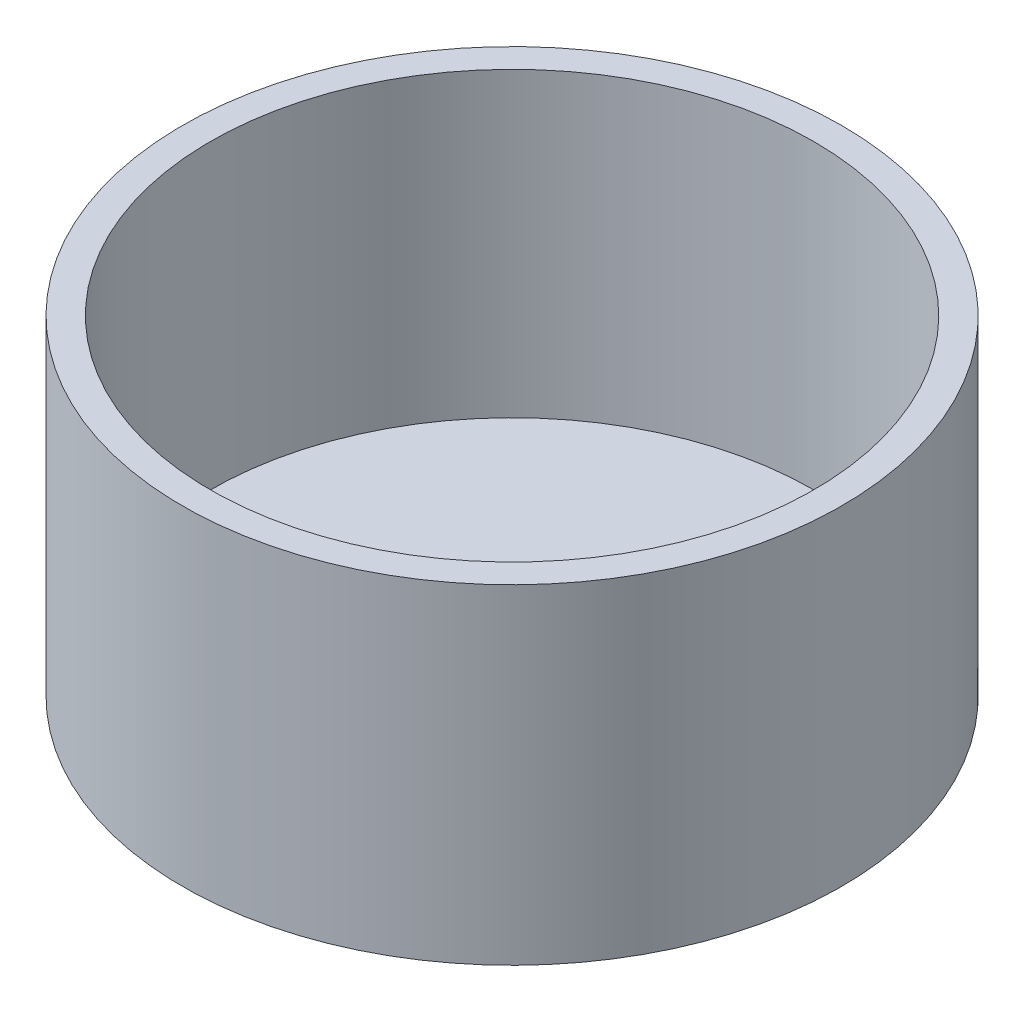
ISO-10303-21;
HEADER;
FILE_DESCRIPTION(('STEP AP214'),'2;1');
FILE_NAME('part.step','',(''),(''),'','','');
FILE_SCHEMA(('AUTOMOTIVE_DESIGN { 1 0 10303 214 1 1 1 1 }'));
ENDSEC;
DATA;
#1=APPLICATION_CONTEXT('core data for automotive mechanical design processes');
#2=APPLICATION_PROTOCOL_DEFINITION('international standard','automotive_design',2000,#1);
#3=PRODUCT_CONTEXT('',#1,'mechanical');
#4=PRODUCT('Part','Part','',(#3));
#5=PRODUCT_RELATED_PRODUCT_CATEGORY('part','',(#4));
#6=PRODUCT_DEFINITION_FORMATION('','',#4);
#7=PRODUCT_DEFINITION_CONTEXT('part definition',#1,'design');
#8=PRODUCT_DEFINITION('design','',#6,#7);
#9=PRODUCT_DEFINITION_SHAPE('','',#8);
#10=(LENGTH_UNIT() NAMED_UNIT(*) SI_UNIT(.MILLI.,.METRE.));
#11=(NAMED_UNIT(*) PLANE_ANGLE_UNIT() SI_UNIT($,.RADIAN.));
#12=(NAMED_UNIT(*) SI_UNIT($,.STERADIAN.) SOLID_ANGLE_UNIT());
#13=UNCERTAINTY_MEASURE_WITH_UNIT(LENGTH_MEASURE(1.E-05),#10,'distance_accuracy_value','');
#14=(GEOMETRIC_REPRESENTATION_CONTEXT(3) GLOBAL_UNCERTAINTY_ASSIGNED_CONTEXT((#13)) GLOBAL_UNIT_ASSIGNED_CONTEXT((#10,
#11,#12)) REPRESENTATION_CONTEXT('',''));
#15=CARTESIAN_POINT('',(0.,0.,0.));
#16=DIRECTION('',(0.,0.,1.));
#17=DIRECTION('',(1.,0.,0.));
#18=AXIS2_PLACEMENT_3D('',#15,#16,#17);
#19=CARTESIAN_POINT('',(0.,54.19,0.));
#20=DIRECTION('',(0.,1.,0.));
#21=DIRECTION('',(0.,0.,1.));
#22=AXIS2_PLACEMENT_3D('',#19,#20,#21);
#23=PLANE('',#22);
#24=CARTESIAN_POINT('',(0.,54.19,0.));
#25=DIRECTION('',(0.,1.,0.));
#26=DIRECTION('',(0.,0.,1.));
#27=AXIS2_PLACEMENT_3D('',#24,#25,#26);
#28=CIRCLE('',#27,59.19);
#29=CARTESIAN_POINT('',(0.,54.19,-59.19));
#30=VERTEX_POINT('',#29);
#31=EDGE_CURVE('E11',#30,#30,#28,.T.);
#32=ORIENTED_EDGE('',*,*,#31,.T.);
#33=EDGE_LOOP('',(#32));
#34=FACE_BOUND('',#33,.T.);
#35=CARTESIAN_POINT('',(0.,54.19,0.));
#36=DIRECTION('',(0.,1.,0.));
#37=DIRECTION('',(0.,0.,1.));
#38=AXIS2_PLACEMENT_3D('',#35,#36,#37);
#39=CIRCLE('',#38,54.19);
#40=CARTESIAN_POINT('',(0.,54.19,-54.19));
#41=VERTEX_POINT('',#40);
#42=EDGE_CURVE('E57',#41,#41,#39,.T.);
#43=ORIENTED_EDGE('',*,*,#42,.F.);
#44=EDGE_LOOP('',(#43));
#45=FACE_BOUND('',#44,.T.);
#46=ADVANCED_FACE('F49',(#34,#45),#23,.T.);
#47=CARTESIAN_POINT('',(0.,54.19,0.));
#48=DIRECTION('',(0.,-1.,0.));
#49=DIRECTION('',(0.,0.,-1.));
#50=AXIS2_PLACEMENT_3D('',#47,#48,#49);
#51=CYLINDRICAL_SURFACE('',#50,59.19);
#52=CARTESIAN_POINT('',(0.,-5.,0.));
#53=DIRECTION('',(0.,1.,0.));
#54=DIRECTION('',(0.,0.,1.));
#55=AXIS2_PLACEMENT_3D('',#52,#53,#54);
#56=CIRCLE('',#55,59.19);
#57=CARTESIAN_POINT('',(0.,-5.,-59.19));
#58=VERTEX_POINT('',#57);
#59=EDGE_CURVE('E68',#58,#58,#56,.T.);
#60=CARTESIAN_POINT('',(0.,54.19,-59.19));
#61=CARTESIAN_POINT('',(0.,53.5734375,-59.19));
#62=CARTESIAN_POINT('',(0.,52.956875,-59.19));
#63=CARTESIAN_POINT('',(0.,51.72375,-59.19));
#64=CARTESIAN_POINT('',(0.,51.1071875,-59.19));
#65=CARTESIAN_POINT('',(0.,49.8740625,-59.19));
#66=CARTESIAN_POINT('',(0.,49.2575,-59.19));
#67=CARTESIAN_POINT('',(0.,48.024375,-59.19));
#68=CARTESIAN_POINT('',(0.,47.4078125,-59.19));
#69=CARTESIAN_POINT('',(0.,46.1746875,-59.19));
#70=CARTESIAN_POINT('',(0.,45.558125,-59.19));
#71=CARTESIAN_POINT('',(0.,44.325,-59.19));
#72=CARTESIAN_POINT('',(0.,43.7084375,-59.19));
#73=CARTESIAN_POINT('',(0.,42.4753125,-59.19));
#74=CARTESIAN_POINT('',(0.,41.85875,-59.19));
#75=CARTESIAN_POINT('',(0.,40.625625,-59.19));
#76=CARTESIAN_POINT('',(0.,40.0090625,-59.19));
#77=CARTESIAN_POINT('',(0.,38.7759375,-59.19));
#78=CARTESIAN_POINT('',(0.,38.159375,-59.19));
#79=CARTESIAN_POINT('',(0.,36.92625,-59.19));
#80=CARTESIAN_POINT('',(0.,36.3096875,-59.19));
#81=CARTESIAN_POINT('',(0.,35.0765625,-59.19));
#82=CARTESIAN_POINT('',(0.,34.46,-59.19));
#83=CARTESIAN_POINT('',(0.,33.226875,-59.19));
#84=CARTESIAN_POINT('',(0.,32.6103125,-59.19));
#85=CARTESIAN_POINT('',(0.,31.3771875,-59.19));
#86=CARTESIAN_POINT('',(0.,30.760625,-59.19));
#87=CARTESIAN_POINT('',(0.,29.5275,-59.19));
#88=CARTESIAN_POINT('',(0.,28.9109375,-59.19));
#89=CARTESIAN_POINT('',(0.,27.6778125,-59.19));
#90=CARTESIAN_POINT('',(0.,27.06125,-59.19));
#91=CARTESIAN_POINT('',(0.,25.828125,-59.19));
#92=CARTESIAN_POINT('',(0.,25.2115625,-59.19));
#93=CARTESIAN_POINT('',(0.,23.9784375,-59.19));
#94=CARTESIAN_POINT('',(0.,23.361875,-59.19));
#95=CARTESIAN_POINT('',(0.,22.12875,-59.19));
#96=CARTESIAN_POINT('',(0.,21.5121875,-59.19));
#97=CARTESIAN_POINT('',(0.,20.2790625,-59.19));
#98=CARTESIAN_POINT('',(0.,19.6625,-59.19));
#99=CARTESIAN_POINT('',(0.,18.429375,-59.19));
#100=CARTESIAN_POINT('',(0.,17.8128125,-59.19));
#101=CARTESIAN_POINT('',(0.,16.5796875,-59.19));
#102=CARTESIAN_POINT('',(0.,15.963125,-59.19));
#103=CARTESIAN_POINT('',(0.,14.73,-59.19));
#104=CARTESIAN_POINT('',(0.,14.1134375,-59.19));
#105=CARTESIAN_POINT('',(0.,12.8803125,-59.19));
#106=CARTESIAN_POINT('',(0.,12.26375,-59.19));
#107=CARTESIAN_POINT('',(0.,11.030625,-59.19));
#108=CARTESIAN_POINT('',(0.,10.4140625,-59.19));
#109=CARTESIAN_POINT('',(0.,9.1809375,-59.19));
#110=CARTESIAN_POINT('',(0.,8.564375,-59.19));
#111=CARTESIAN_POINT('',(0.,7.33125,-59.19));
#112=CARTESIAN_POINT('',(0.,6.7146875,-59.19));
#113=CARTESIAN_POINT('',(0.,5.4815625,-59.19));
#114=CARTESIAN_POINT('',(0.,4.86499999999999,-59.19));
#115=CARTESIAN_POINT('',(0.,3.631875,-59.19));
#116=CARTESIAN_POINT('',(0.,3.0153125,-59.19));
#117=CARTESIAN_POINT('',(0.,1.7821875,-59.19));
#118=CARTESIAN_POINT('',(0.,1.165625,-59.19));
#119=CARTESIAN_POINT('',(0.,-0.0675000000000049,-59.19));
#120=CARTESIAN_POINT('',(0.,-0.684062500000006,-59.19));
#121=CARTESIAN_POINT('',(0.,-1.91718750000001,-59.19));
#122=CARTESIAN_POINT('',(0.,-2.53375,-59.19));
#123=CARTESIAN_POINT('',(0.,-3.766875,-59.19));
#124=CARTESIAN_POINT('',(0.,-4.3834375,-59.19));
#125=CARTESIAN_POINT('',(0.,-5.,-59.19));
#126=B_SPLINE_CURVE_WITH_KNOTS('',3,(#60,#61,#62,#63,#64,#65,#66,#67,#68,#69,#70,#71,#72,#73,
#74,#75,#76,#77,#78,#79,#80,#81,#82,#83,#84,#85,#86,#87,#88,#89,#90,#91,#92,#93,#94,#95,#96,#97,
#98,#99,#100,#101,#102,#103,#104,#105,#106,#107,#108,#109,#110,#111,#112,#113,#114,#115,#116,
#117,#118,#119,#120,#121,#122,#123,#124,#125),.UNSPECIFIED.,.F.,.F.,(4,2,2,2,2,2,2,2,2,2,2,2,2,
2,2,2,2,2,2,2,2,2,2,2,2,2,2,2,2,2,2,2,4),(0.,1.8496875,3.699375,5.5490625,7.39875,9.2484375,
11.098125,12.9478125,14.7975,16.6471875,18.496875,20.3465625,22.19625,24.0459375,25.895625,
27.7453125,29.595,31.4446875,33.294375,35.1440625,36.99375,38.8434375,40.693125,42.5428125,
44.3925,46.2421875,48.091875,49.9415625,51.79125,53.6409375,55.490625,57.3403125,59.19),.UNSPECIFIED.);
#127=EDGE_CURVE('BSEAM51',#30,#58,#126,.T.);
#128=ORIENTED_EDGE('',*,*,#31,.F.);
#129=ORIENTED_EDGE('',*,*,#59,.T.);
#130=ORIENTED_EDGE('',*,*,#127,.T.);
#131=ORIENTED_EDGE('',*,*,#127,.F.);
#132=EDGE_LOOP('',(#128,#130,#129,#131));
#133=FACE_BOUND('',#132,.T.);
#134=ADVANCED_FACE('F51',(#133),#51,.T.);
#135=CARTESIAN_POINT('',(0.,54.19,0.));
#136=DIRECTION('',(0.,-1.,0.));
#137=DIRECTION('',(0.,0.,-1.));
#138=AXIS2_PLACEMENT_3D('',#135,#136,#137);
#139=CYLINDRICAL_SURFACE('',#138,54.19);
#140=CARTESIAN_POINT('',(0.,0.,0.));
#141=DIRECTION('',(0.,1.,0.));
#142=DIRECTION('',(0.,0.,1.));
#143=AXIS2_PLACEMENT_3D('',#140,#141,#142);
#144=CIRCLE('',#143,54.19);
#145=CARTESIAN_POINT('',(0.,0.,-54.19));
#146=VERTEX_POINT('',#145);
#147=EDGE_CURVE('E62',#146,#146,#144,.T.);
#148=CARTESIAN_POINT('',(0.,54.19,-54.19));
#149=CARTESIAN_POINT('',(0.,53.6255208333333,-54.19));
#150=CARTESIAN_POINT('',(0.,53.0610416666667,-54.19));
#151=CARTESIAN_POINT('',(0.,51.9320833333333,-54.19));
#152=CARTESIAN_POINT('',(0.,51.3676041666667,-54.19));
#153=CARTESIAN_POINT('',(0.,50.2386458333333,-54.19));
#154=CARTESIAN_POINT('',(0.,49.6741666666667,-54.19));
#155=CARTESIAN_POINT('',(0.,48.5452083333333,-54.19));
#156=CARTESIAN_POINT('',(0.,47.9807291666667,-54.19));
#157=CARTESIAN_POINT('',(0.,46.8517708333333,-54.19));
#158=CARTESIAN_POINT('',(0.,46.2872916666667,-54.19));
#159=CARTESIAN_POINT('',(0.,45.1583333333333,-54.19));
#160=CARTESIAN_POINT('',(0.,44.5938541666667,-54.19));
#161=CARTESIAN_POINT('',(0.,43.4648958333333,-54.19));
#162=CARTESIAN_POINT('',(0.,42.9004166666667,-54.19));
#163=CARTESIAN_POINT('',(0.,41.7714583333333,-54.19));
#164=CARTESIAN_POINT('',(0.,41.2069791666667,-54.19));
#165=CARTESIAN_POINT('',(0.,40.0780208333333,-54.19));
#166=CARTESIAN_POINT('',(0.,39.5135416666667,-54.19));
#167=CARTESIAN_POINT('',(0.,38.3845833333333,-54.19));
#168=CARTESIAN_POINT('',(0.,37.8201041666667,-54.19));
#169=CARTESIAN_POINT('',(0.,36.6911458333333,-54.19));
#170=CARTESIAN_POINT('',(0.,36.1266666666667,-54.19));
#171=CARTESIAN_POINT('',(0.,34.9977083333333,-54.19));
#172=CARTESIAN_POINT('',(0.,34.4332291666667,-54.19));
#173=CARTESIAN_POINT('',(0.,33.3042708333333,-54.19));
#174=CARTESIAN_POINT('',(0.,32.7397916666667,-54.19));
#175=CARTESIAN_POINT('',(0.,31.6108333333333,-54.19));
#176=CARTESIAN_POINT('',(0.,31.0463541666667,-54.19));
#177=CARTESIAN_POINT('',(0.,29.9173958333333,-54.19));
#178=CARTESIAN_POINT('',(0.,29.3529166666667,-54.19));
#179=CARTESIAN_POINT('',(0.,28.2239583333333,-54.19));
#180=CARTESIAN_POINT('',(0.,27.6594791666667,-54.19));
#181=CARTESIAN_POINT('',(0.,26.5305208333333,-54.19));
#182=CARTESIAN_POINT('',(0.,25.9660416666667,-54.19));
#183=CARTESIAN_POINT('',(0.,24.8370833333333,-54.19));
#184=CARTESIAN_POINT('',(0.,24.2726041666667,-54.19));
#185=CARTESIAN_POINT('',(0.,23.1436458333333,-54.19));
#186=CARTESIAN_POINT('',(0.,22.5791666666667,-54.19));
#187=CARTESIAN_POINT('',(0.,21.4502083333333,-54.19));
#188=CARTESIAN_POINT('',(0.,20.8857291666667,-54.19));
#189=CARTESIAN_POINT('',(0.,19.7567708333333,-54.19));
#190=CARTESIAN_POINT('',(0.,19.1922916666667,-54.19));
#191=CARTESIAN_POINT('',(0.,18.0633333333333,-54.19));
#192=CARTESIAN_POINT('',(0.,17.4988541666667,-54.19));
#193=CARTESIAN_POINT('',(0.,16.3698958333333,-54.19));
#194=CARTESIAN_POINT('',(0.,15.8054166666667,-54.19));
#195=CARTESIAN_POINT('',(0.,14.6764583333333,-54.19));
#196=CARTESIAN_POINT('',(0.,14.1119791666667,-54.19));
#197=CARTESIAN_POINT('',(0.,12.9830208333333,-54.19));
#198=CARTESIAN_POINT('',(0.,12.4185416666667,-54.19));
#199=CARTESIAN_POINT('',(0.,11.2895833333333,-54.19));
#200=CARTESIAN_POINT('',(0.,10.7251041666667,-54.19));
#201=CARTESIAN_POINT('',(0.,9.59614583333333,-54.19));
#202=CARTESIAN_POINT('',(0.,9.03166666666667,-54.19));
#203=CARTESIAN_POINT('',(0.,7.90270833333333,-54.19));
#204=CARTESIAN_POINT('',(0.,7.33822916666667,-54.19));
#205=CARTESIAN_POINT('',(0.,6.20927083333334,-54.19));
#206=CARTESIAN_POINT('',(0.,5.64479166666667,-54.19));
#207=CARTESIAN_POINT('',(0.,4.51583333333333,-54.19));
#208=CARTESIAN_POINT('',(0.,3.95135416666667,-54.19));
#209=CARTESIAN_POINT('',(0.,2.82239583333333,-54.19));
#210=CARTESIAN_POINT('',(0.,2.25791666666666,-54.19));
#211=CARTESIAN_POINT('',(0.,1.12895833333333,-54.19));
#212=CARTESIAN_POINT('',(0.,0.564479166666666,-54.19));
#213=CARTESIAN_POINT('',(0.,0.,-54.19));
#214=B_SPLINE_CURVE_WITH_KNOTS('',3,(#148,#149,#150,#151,#152,#153,#154,#155,#156,#157,#158,
#159,#160,#161,#162,#163,#164,#165,#166,#167,#168,#169,#170,#171,#172,#173,#174,#175,#176,#177,
#178,#179,#180,#181,#182,#183,#184,#185,#186,#187,#188,#189,#190,#191,#192,#193,#194,#195,#196,
#197,#198,#199,#200,#201,#202,#203,#204,#205,#206,#207,#208,#209,#210,#211,#212,#213),
.UNSPECIFIED.,.F.,.F.,(4,2,2,2,2,2,2,2,2,2,2,2,2,2,2,2,2,2,2,2,2,2,2,2,2,2,2,2,2,2,2,2,4),(0.,
1.69343750000001,3.386875,5.0803125,6.77375,8.4671875,10.160625,11.8540625,13.5475,15.2409375,
16.934375,18.6278125,20.32125,22.0146875,23.708125,25.4015625,27.095,28.7884375,30.481875,
32.1753125,33.86875,35.5621875,37.255625,38.9490625,40.6425,42.3359375,44.029375,45.7228125,
47.41625,49.1096875,50.803125,52.4965625,54.19),.UNSPECIFIED.);
#215=EDGE_CURVE('BSEAM82',#41,#146,#214,.T.);
#216=ORIENTED_EDGE('',*,*,#42,.T.);
#217=ORIENTED_EDGE('',*,*,#147,.F.);
#218=ORIENTED_EDGE('',*,*,#215,.T.);
#219=ORIENTED_EDGE('',*,*,#215,.F.);
#220=EDGE_LOOP('',(#216,#218,#217,#219));
#221=FACE_BOUND('',#220,.T.);
#222=ADVANCED_FACE('F82',(#221),#139,.F.);
#223=CARTESIAN_POINT('',(0.,0.,0.));
#224=DIRECTION('',(0.,1.,0.));
#225=DIRECTION('',(0.,0.,1.));
#226=AXIS2_PLACEMENT_3D('',#223,#224,#225);
#227=PLANE('',#226);
#228=ORIENTED_EDGE('',*,*,#147,.T.);
#229=EDGE_LOOP('',(#228));
#230=FACE_BOUND('',#229,.T.);
#231=ADVANCED_FACE('F77',(#230),#227,.T.);
#232=CARTESIAN_POINT('',(0.,-5.,0.));
#233=DIRECTION('',(0.,1.,0.));
#234=DIRECTION('',(0.,0.,1.));
#235=AXIS2_PLACEMENT_3D('',#232,#233,#234);
#236=PLANE('',#235);
#237=ORIENTED_EDGE('',*,*,#59,.F.);
#238=EDGE_LOOP('',(#237));
#239=FACE_BOUND('',#238,.T.);
#240=ADVANCED_FACE('F75',(#239),#236,.F.);
#241=CLOSED_SHELL('',(#46,#134,#222,#231,#240));
#242=MANIFOLD_SOLID_BREP('B2',#241);
#243=ADVANCED_BREP_SHAPE_REPRESENTATION('',(#18,#242),#14);
#244=SHAPE_DEFINITION_REPRESENTATION(#9,#243);
ENDSEC;
END-ISO-10303-21;
